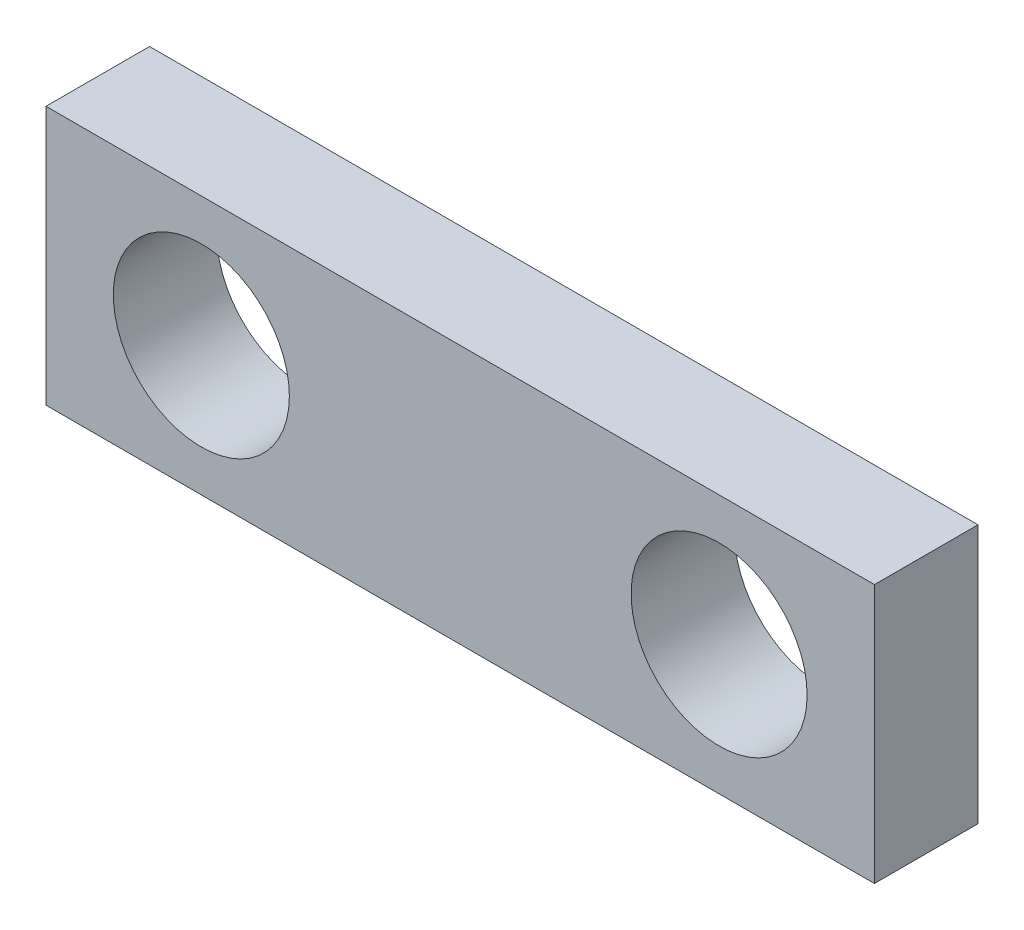
ISO-10303-21;
HEADER;
FILE_DESCRIPTION(('STEP AP214'),'2;1');
FILE_NAME('part.step','',(''),(''),'','','');
FILE_SCHEMA(('AUTOMOTIVE_DESIGN { 1 0 10303 214 1 1 1 1 }'));
ENDSEC;
DATA;
#1=APPLICATION_CONTEXT('core data for automotive mechanical design processes');
#2=APPLICATION_PROTOCOL_DEFINITION('international standard','automotive_design',2000,#1);
#3=PRODUCT_CONTEXT('',#1,'mechanical');
#4=PRODUCT('Part','Part','',(#3));
#5=PRODUCT_RELATED_PRODUCT_CATEGORY('part','',(#4));
#6=PRODUCT_DEFINITION_FORMATION('','',#4);
#7=PRODUCT_DEFINITION_CONTEXT('part definition',#1,'design');
#8=PRODUCT_DEFINITION('design','',#6,#7);
#9=PRODUCT_DEFINITION_SHAPE('','',#8);
#10=(LENGTH_UNIT() NAMED_UNIT(*) SI_UNIT(.MILLI.,.METRE.));
#11=(NAMED_UNIT(*) PLANE_ANGLE_UNIT() SI_UNIT($,.RADIAN.));
#12=(NAMED_UNIT(*) SI_UNIT($,.STERADIAN.) SOLID_ANGLE_UNIT());
#13=UNCERTAINTY_MEASURE_WITH_UNIT(LENGTH_MEASURE(1.E-05),#10,'distance_accuracy_value','');
#14=(GEOMETRIC_REPRESENTATION_CONTEXT(3) GLOBAL_UNCERTAINTY_ASSIGNED_CONTEXT((#13)) GLOBAL_UNIT_ASSIGNED_CONTEXT((#10,
#11,#12)) REPRESENTATION_CONTEXT('',''));
#15=CARTESIAN_POINT('',(0.,0.,0.));
#16=DIRECTION('',(0.,0.,1.));
#17=DIRECTION('',(1.,0.,0.));
#18=AXIS2_PLACEMENT_3D('',#15,#16,#17);
#19=CARTESIAN_POINT('',(0.,0.,2.));
#20=DIRECTION('',(0.,0.,-1.));
#21=DIRECTION('',(-1.,0.,0.));
#22=AXIS2_PLACEMENT_3D('',#19,#20,#21);
#23=PLANE('',#22);
#24=CARTESIAN_POINT('',(3.,2.5,2.));
#25=DIRECTION('',(0.,0.,1.));
#26=DIRECTION('',(1.,0.,0.));
#27=AXIS2_PLACEMENT_3D('',#24,#25,#26);
#28=CIRCLE('',#27,1.7);
#29=CARTESIAN_POINT('',(4.7,2.5,2.));
#30=VERTEX_POINT('',#29);
#31=EDGE_CURVE('E152',#30,#30,#28,.T.);
#32=ORIENTED_EDGE('',*,*,#31,.F.);
#33=EDGE_LOOP('',(#32));
#34=FACE_BOUND('',#33,.T.);
#35=DIRECTION('',(0.,-1.,0.));
#36=VECTOR('',#35,1.);
#37=CARTESIAN_POINT('',(0.,0.,2.));
#38=LINE('',#37,#36);
#39=CARTESIAN_POINT('',(0.,5.,2.));
#40=VERTEX_POINT('',#39);
#41=CARTESIAN_POINT('',(0.,0.,2.));
#42=VERTEX_POINT('',#41);
#43=EDGE_CURVE('E98',#40,#42,#38,.T.);
#44=ORIENTED_EDGE('',*,*,#43,.T.);
#45=DIRECTION('',(1.,0.,0.));
#46=VECTOR('',#45,1.);
#47=CARTESIAN_POINT('',(0.,0.,2.));
#48=LINE('',#47,#46);
#49=CARTESIAN_POINT('',(16.,0.,2.));
#50=VERTEX_POINT('',#49);
#51=EDGE_CURVE('E93',#42,#50,#48,.T.);
#52=ORIENTED_EDGE('',*,*,#51,.T.);
#53=DIRECTION('',(0.,1.,0.));
#54=VECTOR('',#53,1.);
#55=CARTESIAN_POINT('',(16.,0.,2.));
#56=LINE('',#55,#54);
#57=CARTESIAN_POINT('',(16.,5.,2.));
#58=VERTEX_POINT('',#57);
#59=EDGE_CURVE('E96',#50,#58,#56,.T.);
#60=ORIENTED_EDGE('',*,*,#59,.T.);
#61=DIRECTION('',(-1.,0.,0.));
#62=VECTOR('',#61,1.);
#63=CARTESIAN_POINT('',(0.,5.,2.));
#64=LINE('',#63,#62);
#65=EDGE_CURVE('E63',#58,#40,#64,.T.);
#66=ORIENTED_EDGE('',*,*,#65,.T.);
#67=EDGE_LOOP('',(#44,#52,#60,#66));
#68=FACE_BOUND('',#67,.T.);
#69=CARTESIAN_POINT('',(13.,2.5,2.));
#70=DIRECTION('',(0.,0.,1.));
#71=DIRECTION('',(1.,0.,0.));
#72=AXIS2_PLACEMENT_3D('',#69,#70,#71);
#73=CIRCLE('',#72,1.7);
#74=CARTESIAN_POINT('',(14.7,2.5,2.));
#75=VERTEX_POINT('',#74);
#76=EDGE_CURVE('E144',#75,#75,#73,.T.);
#77=ORIENTED_EDGE('',*,*,#76,.F.);
#78=EDGE_LOOP('',(#77));
#79=FACE_BOUND('',#78,.T.);
#80=ADVANCED_FACE('F45',(#34,#68,#79),#23,.F.);
#81=CARTESIAN_POINT('',(0.,0.,2.));
#82=DIRECTION('',(1.,0.,0.));
#83=DIRECTION('',(0.,0.,-1.));
#84=AXIS2_PLACEMENT_3D('',#81,#82,#83);
#85=PLANE('',#84);
#86=DIRECTION('',(0.,-1.,0.));
#87=VECTOR('',#86,1.);
#88=CARTESIAN_POINT('',(0.,0.,0.));
#89=LINE('',#88,#87);
#90=CARTESIAN_POINT('',(0.,5.,0.));
#91=VERTEX_POINT('',#90);
#92=CARTESIAN_POINT('',(0.,0.,0.));
#93=VERTEX_POINT('',#92);
#94=EDGE_CURVE('E116',#91,#93,#89,.T.);
#95=ORIENTED_EDGE('',*,*,#94,.T.);
#96=DIRECTION('',(0.,0.,-1.));
#97=VECTOR('',#96,1.);
#98=CARTESIAN_POINT('',(0.,0.,2.));
#99=LINE('',#98,#97);
#100=EDGE_CURVE('E11',#42,#93,#99,.T.);
#101=ORIENTED_EDGE('',*,*,#100,.F.);
#102=ORIENTED_EDGE('',*,*,#43,.F.);
#103=DIRECTION('',(0.,0.,-1.));
#104=VECTOR('',#103,1.);
#105=CARTESIAN_POINT('',(0.,5.,2.));
#106=LINE('',#105,#104);
#107=EDGE_CURVE('E112',#40,#91,#106,.T.);
#108=ORIENTED_EDGE('',*,*,#107,.T.);
#109=EDGE_LOOP('',(#95,#101,#102,#108));
#110=FACE_BOUND('',#109,.T.);
#111=ADVANCED_FACE('F47',(#110),#85,.F.);
#112=CARTESIAN_POINT('',(0.,0.,2.));
#113=DIRECTION('',(0.,1.,0.));
#114=DIRECTION('',(0.,0.,1.));
#115=AXIS2_PLACEMENT_3D('',#112,#113,#114);
#116=PLANE('',#115);
#117=DIRECTION('',(1.,0.,0.));
#118=VECTOR('',#117,1.);
#119=CARTESIAN_POINT('',(0.,0.,0.));
#120=LINE('',#119,#118);
#121=CARTESIAN_POINT('',(16.,0.,0.));
#122=VERTEX_POINT('',#121);
#123=EDGE_CURVE('E103',#93,#122,#120,.T.);
#124=ORIENTED_EDGE('',*,*,#123,.T.);
#125=DIRECTION('',(0.,0.,-1.));
#126=VECTOR('',#125,1.);
#127=CARTESIAN_POINT('',(16.,0.,2.));
#128=LINE('',#127,#126);
#129=EDGE_CURVE('E55',#50,#122,#128,.T.);
#130=ORIENTED_EDGE('',*,*,#129,.F.);
#131=ORIENTED_EDGE('',*,*,#51,.F.);
#132=ORIENTED_EDGE('',*,*,#100,.T.);
#133=EDGE_LOOP('',(#124,#130,#131,#132));
#134=FACE_BOUND('',#133,.T.);
#135=ADVANCED_FACE('F102',(#134),#116,.F.);
#136=CARTESIAN_POINT('',(16.,0.,2.));
#137=DIRECTION('',(-1.,0.,0.));
#138=DIRECTION('',(0.,0.,1.));
#139=AXIS2_PLACEMENT_3D('',#136,#137,#138);
#140=PLANE('',#139);
#141=DIRECTION('',(0.,1.,0.));
#142=VECTOR('',#141,1.);
#143=CARTESIAN_POINT('',(16.,0.,0.));
#144=LINE('',#143,#142);
#145=CARTESIAN_POINT('',(16.,5.,0.));
#146=VERTEX_POINT('',#145);
#147=EDGE_CURVE('E80',#122,#146,#144,.T.);
#148=ORIENTED_EDGE('',*,*,#147,.T.);
#149=DIRECTION('',(0.,0.,-1.));
#150=VECTOR('',#149,1.);
#151=CARTESIAN_POINT('',(16.,5.,2.));
#152=LINE('',#151,#150);
#153=EDGE_CURVE('E105',#58,#146,#152,.T.);
#154=ORIENTED_EDGE('',*,*,#153,.F.);
#155=ORIENTED_EDGE('',*,*,#59,.F.);
#156=ORIENTED_EDGE('',*,*,#129,.T.);
#157=EDGE_LOOP('',(#148,#154,#155,#156));
#158=FACE_BOUND('',#157,.T.);
#159=ADVANCED_FACE('F106',(#158),#140,.F.);
#160=CARTESIAN_POINT('',(0.,5.,2.));
#161=DIRECTION('',(0.,-1.,0.));
#162=DIRECTION('',(0.,0.,-1.));
#163=AXIS2_PLACEMENT_3D('',#160,#161,#162);
#164=PLANE('',#163);
#165=DIRECTION('',(-1.,0.,0.));
#166=VECTOR('',#165,1.);
#167=CARTESIAN_POINT('',(0.,5.,0.));
#168=LINE('',#167,#166);
#169=EDGE_CURVE('E86',#146,#91,#168,.T.);
#170=ORIENTED_EDGE('',*,*,#169,.T.);
#171=ORIENTED_EDGE('',*,*,#107,.F.);
#172=ORIENTED_EDGE('',*,*,#65,.F.);
#173=ORIENTED_EDGE('',*,*,#153,.T.);
#174=EDGE_LOOP('',(#170,#171,#172,#173));
#175=FACE_BOUND('',#174,.T.);
#176=ADVANCED_FACE('F132',(#175),#164,.F.);
#177=CARTESIAN_POINT('',(0.,0.,0.));
#178=DIRECTION('',(0.,0.,-1.));
#179=DIRECTION('',(-1.,0.,0.));
#180=AXIS2_PLACEMENT_3D('',#177,#178,#179);
#181=PLANE('',#180);
#182=CARTESIAN_POINT('',(3.,2.5,0.));
#183=DIRECTION('',(0.,0.,-1.));
#184=DIRECTION('',(-1.,0.,0.));
#185=AXIS2_PLACEMENT_3D('',#182,#183,#184);
#186=CIRCLE('',#185,1.7);
#187=CARTESIAN_POINT('',(1.3,2.5,0.));
#188=VERTEX_POINT('',#187);
#189=EDGE_CURVE('E148',#188,#188,#186,.T.);
#190=ORIENTED_EDGE('',*,*,#189,.F.);
#191=EDGE_LOOP('',(#190));
#192=FACE_BOUND('',#191,.T.);
#193=CARTESIAN_POINT('',(13.,2.5,0.));
#194=DIRECTION('',(0.,0.,-1.));
#195=DIRECTION('',(-1.,0.,0.));
#196=AXIS2_PLACEMENT_3D('',#193,#194,#195);
#197=CIRCLE('',#196,1.7);
#198=CARTESIAN_POINT('',(11.3,2.5,0.));
#199=VERTEX_POINT('',#198);
#200=EDGE_CURVE('E120',#199,#199,#197,.T.);
#201=ORIENTED_EDGE('',*,*,#200,.F.);
#202=EDGE_LOOP('',(#201));
#203=FACE_BOUND('',#202,.T.);
#204=ORIENTED_EDGE('',*,*,#94,.F.);
#205=ORIENTED_EDGE('',*,*,#169,.F.);
#206=ORIENTED_EDGE('',*,*,#147,.F.);
#207=ORIENTED_EDGE('',*,*,#123,.F.);
#208=EDGE_LOOP('',(#204,#205,#206,#207));
#209=FACE_BOUND('',#208,.T.);
#210=ADVANCED_FACE('F135',(#192,#203,#209),#181,.T.);
#211=CARTESIAN_POINT('',(13.,2.5,2.));
#212=DIRECTION('',(0.,0.,1.));
#213=DIRECTION('',(1.,0.,0.));
#214=AXIS2_PLACEMENT_3D('',#211,#212,#213);
#215=CYLINDRICAL_SURFACE('',#214,1.7);
#216=ORIENTED_EDGE('',*,*,#76,.T.);
#217=EDGE_LOOP('',(#216));
#218=FACE_BOUND('',#217,.T.);
#219=ORIENTED_EDGE('',*,*,#200,.T.);
#220=EDGE_LOOP('',(#219));
#221=FACE_BOUND('',#220,.T.);
#222=ADVANCED_FACE('F169',(#218,#221),#215,.F.);
#223=CARTESIAN_POINT('',(3.,2.5,2.));
#224=DIRECTION('',(0.,0.,1.));
#225=DIRECTION('',(1.,0.,0.));
#226=AXIS2_PLACEMENT_3D('',#223,#224,#225);
#227=CYLINDRICAL_SURFACE('',#226,1.7);
#228=ORIENTED_EDGE('',*,*,#31,.T.);
#229=EDGE_LOOP('',(#228));
#230=FACE_BOUND('',#229,.T.);
#231=ORIENTED_EDGE('',*,*,#189,.T.);
#232=EDGE_LOOP('',(#231));
#233=FACE_BOUND('',#232,.T.);
#234=ADVANCED_FACE('F159',(#230,#233),#227,.F.);
#235=CLOSED_SHELL('',(#80,#111,#135,#159,#176,#210,#222,#234));
#236=MANIFOLD_SOLID_BREP('B2',#235);
#237=ADVANCED_BREP_SHAPE_REPRESENTATION('',(#18,#236),#14);
#238=SHAPE_DEFINITION_REPRESENTATION(#9,#237);
ENDSEC;
END-ISO-10303-21;
